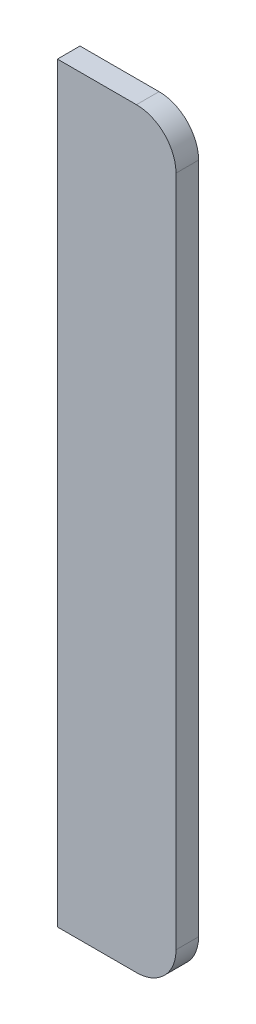
ISO-10303-21;
HEADER;
FILE_DESCRIPTION(('STEP AP214'),'2;1');
FILE_NAME('part.step','',(''),(''),'','','');
FILE_SCHEMA(('AUTOMOTIVE_DESIGN { 1 0 10303 214 1 1 1 1 }'));
ENDSEC;
DATA;
#1=APPLICATION_CONTEXT('core data for automotive mechanical design processes');
#2=APPLICATION_PROTOCOL_DEFINITION('international standard','automotive_design',2000,#1);
#3=PRODUCT_CONTEXT('',#1,'mechanical');
#4=PRODUCT('Part','Part','',(#3));
#5=PRODUCT_RELATED_PRODUCT_CATEGORY('part','',(#4));
#6=PRODUCT_DEFINITION_FORMATION('','',#4);
#7=PRODUCT_DEFINITION_CONTEXT('part definition',#1,'design');
#8=PRODUCT_DEFINITION('design','',#6,#7);
#9=PRODUCT_DEFINITION_SHAPE('','',#8);
#10=(LENGTH_UNIT() NAMED_UNIT(*) SI_UNIT(.MILLI.,.METRE.));
#11=(NAMED_UNIT(*) PLANE_ANGLE_UNIT() SI_UNIT($,.RADIAN.));
#12=(NAMED_UNIT(*) SI_UNIT($,.STERADIAN.) SOLID_ANGLE_UNIT());
#13=UNCERTAINTY_MEASURE_WITH_UNIT(LENGTH_MEASURE(1.E-05),#10,'distance_accuracy_value','');
#14=(GEOMETRIC_REPRESENTATION_CONTEXT(3) GLOBAL_UNCERTAINTY_ASSIGNED_CONTEXT((#13)) GLOBAL_UNIT_ASSIGNED_CONTEXT((#10,
#11,#12)) REPRESENTATION_CONTEXT('',''));
#15=CARTESIAN_POINT('',(0.,0.,0.));
#16=DIRECTION('',(0.,0.,1.));
#17=DIRECTION('',(1.,0.,0.));
#18=AXIS2_PLACEMENT_3D('',#15,#16,#17);
#19=CARTESIAN_POINT('',(703.476210857034,997.666263370689,4.));
#20=DIRECTION('',(0.,0.,-1.));
#21=DIRECTION('',(-1.,0.,0.));
#22=AXIS2_PLACEMENT_3D('',#19,#20,#21);
#23=CYLINDRICAL_SURFACE('',#22,7.00000000000012);
#24=CARTESIAN_POINT('',(703.476210857034,997.666263370689,0.));
#25=DIRECTION('',(0.,0.,1.));
#26=DIRECTION('',(1.,0.,0.));
#27=AXIS2_PLACEMENT_3D('',#24,#25,#26);
#28=CIRCLE('',#27,7.00000000000012);
#29=CARTESIAN_POINT('',(710.476210857034,997.666263370689,0.));
#30=VERTEX_POINT('',#29);
#31=CARTESIAN_POINT('',(703.476210857034,1004.66626337069,0.));
#32=VERTEX_POINT('',#31);
#33=EDGE_CURVE('E117',#30,#32,#28,.T.);
#34=ORIENTED_EDGE('',*,*,#33,.T.);
#35=DIRECTION('',(0.,0.,-1.));
#36=VECTOR('',#35,1.);
#37=CARTESIAN_POINT('',(703.476210857034,1004.66626337069,4.));
#38=LINE('',#37,#36);
#39=CARTESIAN_POINT('',(703.476210857034,1004.66626337069,4.));
#40=VERTEX_POINT('',#39);
#41=EDGE_CURVE('E11',#40,#32,#38,.T.);
#42=ORIENTED_EDGE('',*,*,#41,.F.);
#43=CARTESIAN_POINT('',(703.476210857034,997.666263370689,4.));
#44=DIRECTION('',(0.,0.,1.));
#45=DIRECTION('',(1.,0.,0.));
#46=AXIS2_PLACEMENT_3D('',#43,#44,#45);
#47=CIRCLE('',#46,7.00000000000012);
#48=CARTESIAN_POINT('',(710.476210857034,997.666263370689,4.));
#49=VERTEX_POINT('',#48);
#50=EDGE_CURVE('E127',#49,#40,#47,.T.);
#51=ORIENTED_EDGE('',*,*,#50,.F.);
#52=DIRECTION('',(0.,0.,-1.));
#53=VECTOR('',#52,1.);
#54=CARTESIAN_POINT('',(710.476210857034,997.666263370689,4.));
#55=LINE('',#54,#53);
#56=EDGE_CURVE('E113',#49,#30,#55,.T.);
#57=ORIENTED_EDGE('',*,*,#56,.T.);
#58=EDGE_LOOP('',(#34,#42,#51,#57));
#59=FACE_BOUND('',#58,.T.);
#60=ADVANCED_FACE('F33',(#59),#23,.T.);
#61=CARTESIAN_POINT('',(689.476210857034,1004.66626337069,4.));
#62=DIRECTION('',(0.,-1.,0.));
#63=DIRECTION('',(0.,0.,-1.));
#64=AXIS2_PLACEMENT_3D('',#61,#62,#63);
#65=PLANE('',#64);
#66=DIRECTION('',(-1.,0.,0.));
#67=VECTOR('',#66,1.);
#68=CARTESIAN_POINT('',(689.476210857034,1004.66626337069,0.));
#69=LINE('',#68,#67);
#70=CARTESIAN_POINT('',(689.476210857034,1004.66626337069,0.));
#71=VERTEX_POINT('',#70);
#72=EDGE_CURVE('E120',#32,#71,#69,.T.);
#73=ORIENTED_EDGE('',*,*,#72,.T.);
#74=DIRECTION('',(0.,0.,-1.));
#75=VECTOR('',#74,1.);
#76=CARTESIAN_POINT('',(689.476210857034,1004.66626337069,4.));
#77=LINE('',#76,#75);
#78=CARTESIAN_POINT('',(689.476210857034,1004.66626337069,4.));
#79=VERTEX_POINT('',#78);
#80=EDGE_CURVE('E41',#79,#71,#77,.T.);
#81=ORIENTED_EDGE('',*,*,#80,.F.);
#82=DIRECTION('',(-1.,0.,0.));
#83=VECTOR('',#82,1.);
#84=CARTESIAN_POINT('',(689.476210857034,1004.66626337069,4.));
#85=LINE('',#84,#83);
#86=EDGE_CURVE('E86',#40,#79,#85,.T.);
#87=ORIENTED_EDGE('',*,*,#86,.F.);
#88=ORIENTED_EDGE('',*,*,#41,.T.);
#89=EDGE_LOOP('',(#73,#81,#87,#88));
#90=FACE_BOUND('',#89,.T.);
#91=ADVANCED_FACE('F151',(#90),#65,.F.);
#92=CARTESIAN_POINT('',(689.476210857034,871.544943027129,4.));
#93=DIRECTION('',(1.,0.,0.));
#94=DIRECTION('',(0.,0.,-1.));
#95=AXIS2_PLACEMENT_3D('',#92,#93,#94);
#96=PLANE('',#95);
#97=DIRECTION('',(0.,-1.,0.));
#98=VECTOR('',#97,1.);
#99=CARTESIAN_POINT('',(689.476210857034,871.544943027129,0.));
#100=LINE('',#99,#98);
#101=CARTESIAN_POINT('',(689.476210857034,871.544943027129,0.));
#102=VERTEX_POINT('',#101);
#103=EDGE_CURVE('E122',#71,#102,#100,.T.);
#104=ORIENTED_EDGE('',*,*,#103,.T.);
#105=DIRECTION('',(0.,0.,-1.));
#106=VECTOR('',#105,1.);
#107=CARTESIAN_POINT('',(689.476210857034,871.544943027129,4.));
#108=LINE('',#107,#106);
#109=CARTESIAN_POINT('',(689.476210857034,871.544943027129,4.));
#110=VERTEX_POINT('',#109);
#111=EDGE_CURVE('E108',#110,#102,#108,.T.);
#112=ORIENTED_EDGE('',*,*,#111,.F.);
#113=DIRECTION('',(0.,-1.,0.));
#114=VECTOR('',#113,1.);
#115=CARTESIAN_POINT('',(689.476210857034,871.544943027129,4.));
#116=LINE('',#115,#114);
#117=EDGE_CURVE('E99',#79,#110,#116,.T.);
#118=ORIENTED_EDGE('',*,*,#117,.F.);
#119=ORIENTED_EDGE('',*,*,#80,.T.);
#120=EDGE_LOOP('',(#104,#112,#118,#119));
#121=FACE_BOUND('',#120,.T.);
#122=ADVANCED_FACE('F133',(#121),#96,.F.);
#123=CARTESIAN_POINT('',(703.476210857034,871.544943027129,4.));
#124=DIRECTION('',(0.,1.,0.));
#125=DIRECTION('',(0.,0.,1.));
#126=AXIS2_PLACEMENT_3D('',#123,#124,#125);
#127=PLANE('',#126);
#128=DIRECTION('',(1.,0.,0.));
#129=VECTOR('',#128,1.);
#130=CARTESIAN_POINT('',(703.476210857034,871.544943027129,0.));
#131=LINE('',#130,#129);
#132=CARTESIAN_POINT('',(703.476210857034,871.544943027129,0.));
#133=VERTEX_POINT('',#132);
#134=EDGE_CURVE('E107',#102,#133,#131,.T.);
#135=ORIENTED_EDGE('',*,*,#134,.T.);
#136=DIRECTION('',(0.,0.,-1.));
#137=VECTOR('',#136,1.);
#138=CARTESIAN_POINT('',(703.476210857034,871.544943027129,4.));
#139=LINE('',#138,#137);
#140=CARTESIAN_POINT('',(703.476210857034,871.544943027129,4.));
#141=VERTEX_POINT('',#140);
#142=EDGE_CURVE('E104',#141,#133,#139,.T.);
#143=ORIENTED_EDGE('',*,*,#142,.F.);
#144=DIRECTION('',(1.,0.,0.));
#145=VECTOR('',#144,1.);
#146=CARTESIAN_POINT('',(703.476210857034,871.544943027129,4.));
#147=LINE('',#146,#145);
#148=EDGE_CURVE('E93',#110,#141,#147,.T.);
#149=ORIENTED_EDGE('',*,*,#148,.F.);
#150=ORIENTED_EDGE('',*,*,#111,.T.);
#151=EDGE_LOOP('',(#135,#143,#149,#150));
#152=FACE_BOUND('',#151,.T.);
#153=ADVANCED_FACE('F105',(#152),#127,.F.);
#154=CARTESIAN_POINT('',(703.476210857034,878.544943027129,4.));
#155=DIRECTION('',(0.,0.,-1.));
#156=DIRECTION('',(-1.,0.,0.));
#157=AXIS2_PLACEMENT_3D('',#154,#155,#156);
#158=CYLINDRICAL_SURFACE('',#157,6.99999999999995);
#159=CARTESIAN_POINT('',(703.476210857034,878.544943027129,0.));
#160=DIRECTION('',(0.,0.,1.));
#161=DIRECTION('',(1.,0.,0.));
#162=AXIS2_PLACEMENT_3D('',#159,#160,#161);
#163=CIRCLE('',#162,6.99999999999995);
#164=CARTESIAN_POINT('',(710.476210857034,878.544943027129,0.));
#165=VERTEX_POINT('',#164);
#166=EDGE_CURVE('E72',#133,#165,#163,.T.);
#167=ORIENTED_EDGE('',*,*,#166,.T.);
#168=DIRECTION('',(0.,0.,-1.));
#169=VECTOR('',#168,1.);
#170=CARTESIAN_POINT('',(710.476210857034,878.544943027129,4.));
#171=LINE('',#170,#169);
#172=CARTESIAN_POINT('',(710.476210857034,878.544943027129,4.));
#173=VERTEX_POINT('',#172);
#174=EDGE_CURVE('E109',#173,#165,#171,.T.);
#175=ORIENTED_EDGE('',*,*,#174,.F.);
#176=CARTESIAN_POINT('',(703.476210857034,878.544943027129,4.));
#177=DIRECTION('',(0.,0.,1.));
#178=DIRECTION('',(1.,0.,0.));
#179=AXIS2_PLACEMENT_3D('',#176,#177,#178);
#180=CIRCLE('',#179,6.99999999999995);
#181=EDGE_CURVE('E97',#141,#173,#180,.T.);
#182=ORIENTED_EDGE('',*,*,#181,.F.);
#183=ORIENTED_EDGE('',*,*,#142,.T.);
#184=EDGE_LOOP('',(#167,#175,#182,#183));
#185=FACE_BOUND('',#184,.T.);
#186=ADVANCED_FACE('F111',(#185),#158,.T.);
#187=CARTESIAN_POINT('',(710.476210857034,997.666263370689,4.));
#188=DIRECTION('',(-1.,0.,0.));
#189=DIRECTION('',(0.,0.,1.));
#190=AXIS2_PLACEMENT_3D('',#187,#188,#189);
#191=PLANE('',#190);
#192=DIRECTION('',(0.,1.,0.));
#193=VECTOR('',#192,1.);
#194=CARTESIAN_POINT('',(710.476210857034,997.666263370689,0.));
#195=LINE('',#194,#193);
#196=EDGE_CURVE('E78',#165,#30,#195,.T.);
#197=ORIENTED_EDGE('',*,*,#196,.T.);
#198=ORIENTED_EDGE('',*,*,#56,.F.);
#199=DIRECTION('',(0.,1.,0.));
#200=VECTOR('',#199,1.);
#201=CARTESIAN_POINT('',(710.476210857034,997.666263370689,4.));
#202=LINE('',#201,#200);
#203=EDGE_CURVE('E49',#173,#49,#202,.T.);
#204=ORIENTED_EDGE('',*,*,#203,.F.);
#205=ORIENTED_EDGE('',*,*,#174,.T.);
#206=EDGE_LOOP('',(#197,#198,#204,#205));
#207=FACE_BOUND('',#206,.T.);
#208=ADVANCED_FACE('F140',(#207),#191,.F.);
#209=CARTESIAN_POINT('',(703.476210857034,997.666263370689,4.));
#210=DIRECTION('',(0.,0.,1.));
#211=DIRECTION('',(1.,0.,0.));
#212=AXIS2_PLACEMENT_3D('',#209,#210,#211);
#213=PLANE('',#212);
#214=ORIENTED_EDGE('',*,*,#50,.T.);
#215=ORIENTED_EDGE('',*,*,#86,.T.);
#216=ORIENTED_EDGE('',*,*,#117,.T.);
#217=ORIENTED_EDGE('',*,*,#148,.T.);
#218=ORIENTED_EDGE('',*,*,#181,.T.);
#219=ORIENTED_EDGE('',*,*,#203,.T.);
#220=EDGE_LOOP('',(#214,#215,#216,#217,#218,#219));
#221=FACE_BOUND('',#220,.T.);
#222=ADVANCED_FACE('F95',(#221),#213,.T.);
#223=CARTESIAN_POINT('',(703.476210857034,997.666263370689,0.));
#224=DIRECTION('',(0.,0.,1.));
#225=DIRECTION('',(1.,0.,0.));
#226=AXIS2_PLACEMENT_3D('',#223,#224,#225);
#227=PLANE('',#226);
#228=ORIENTED_EDGE('',*,*,#33,.F.);
#229=ORIENTED_EDGE('',*,*,#196,.F.);
#230=ORIENTED_EDGE('',*,*,#166,.F.);
#231=ORIENTED_EDGE('',*,*,#134,.F.);
#232=ORIENTED_EDGE('',*,*,#103,.F.);
#233=ORIENTED_EDGE('',*,*,#72,.F.);
#234=EDGE_LOOP('',(#228,#229,#230,#231,#232,#233));
#235=FACE_BOUND('',#234,.T.);
#236=ADVANCED_FACE('F136',(#235),#227,.F.);
#237=CLOSED_SHELL('',(#60,#91,#122,#153,#186,#208,#222,#236));
#238=MANIFOLD_SOLID_BREP('B2',#237);
#239=ADVANCED_BREP_SHAPE_REPRESENTATION('',(#18,#238),#14);
#240=SHAPE_DEFINITION_REPRESENTATION(#9,#239);
ENDSEC;
END-ISO-10303-21;
